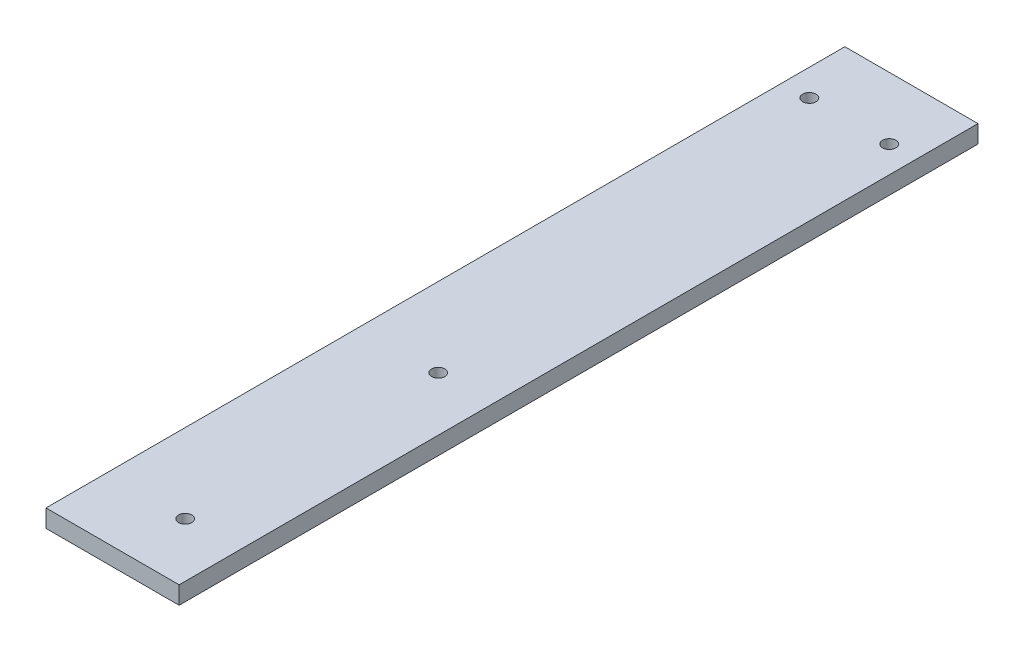
ISO-10303-21;
HEADER;
FILE_DESCRIPTION(('STEP AP214'),'2;1');
FILE_NAME('part.step','',(''),(''),'','','');
FILE_SCHEMA(('AUTOMOTIVE_DESIGN { 1 0 10303 214 1 1 1 1 }'));
ENDSEC;
DATA;
#1=APPLICATION_CONTEXT('core data for automotive mechanical design processes');
#2=APPLICATION_PROTOCOL_DEFINITION('international standard','automotive_design',2000,#1);
#3=PRODUCT_CONTEXT('',#1,'mechanical');
#4=PRODUCT('Part','Part','',(#3));
#5=PRODUCT_RELATED_PRODUCT_CATEGORY('part','',(#4));
#6=PRODUCT_DEFINITION_FORMATION('','',#4);
#7=PRODUCT_DEFINITION_CONTEXT('part definition',#1,'design');
#8=PRODUCT_DEFINITION('design','',#6,#7);
#9=PRODUCT_DEFINITION_SHAPE('','',#8);
#10=(LENGTH_UNIT() NAMED_UNIT(*) SI_UNIT(.MILLI.,.METRE.));
#11=(NAMED_UNIT(*) PLANE_ANGLE_UNIT() SI_UNIT($,.RADIAN.));
#12=(NAMED_UNIT(*) SI_UNIT($,.STERADIAN.) SOLID_ANGLE_UNIT());
#13=UNCERTAINTY_MEASURE_WITH_UNIT(LENGTH_MEASURE(1.E-05),#10,'distance_accuracy_value','');
#14=(GEOMETRIC_REPRESENTATION_CONTEXT(3) GLOBAL_UNCERTAINTY_ASSIGNED_CONTEXT((#13)) GLOBAL_UNIT_ASSIGNED_CONTEXT((#10,
#11,#12)) REPRESENTATION_CONTEXT('',''));
#15=CARTESIAN_POINT('',(0.,0.,0.));
#16=DIRECTION('',(0.,0.,1.));
#17=DIRECTION('',(1.,0.,0.));
#18=AXIS2_PLACEMENT_3D('',#15,#16,#17);
#19=CARTESIAN_POINT('',(15.,0.,90.));
#20=DIRECTION('',(-1.,0.,0.));
#21=DIRECTION('',(0.,0.,1.));
#22=AXIS2_PLACEMENT_3D('',#19,#20,#21);
#23=PLANE('',#22);
#24=DIRECTION('',(0.,1.,0.));
#25=VECTOR('',#24,1.);
#26=CARTESIAN_POINT('',(15.,0.,0.));
#27=LINE('',#26,#25);
#28=CARTESIAN_POINT('',(15.,0.,0.));
#29=VERTEX_POINT('',#28);
#30=CARTESIAN_POINT('',(15.,2.,0.));
#31=VERTEX_POINT('',#30);
#32=EDGE_CURVE('E105',#29,#31,#27,.T.);
#33=ORIENTED_EDGE('',*,*,#32,.T.);
#34=DIRECTION('',(0.,0.,-1.));
#35=VECTOR('',#34,1.);
#36=CARTESIAN_POINT('',(15.,2.,90.));
#37=LINE('',#36,#35);
#38=CARTESIAN_POINT('',(15.,2.,90.));
#39=VERTEX_POINT('',#38);
#40=EDGE_CURVE('E11',#39,#31,#37,.T.);
#41=ORIENTED_EDGE('',*,*,#40,.F.);
#42=DIRECTION('',(0.,1.,0.));
#43=VECTOR('',#42,1.);
#44=CARTESIAN_POINT('',(15.,0.,90.));
#45=LINE('',#44,#43);
#46=CARTESIAN_POINT('',(15.,0.,90.));
#47=VERTEX_POINT('',#46);
#48=EDGE_CURVE('E89',#47,#39,#45,.T.);
#49=ORIENTED_EDGE('',*,*,#48,.F.);
#50=DIRECTION('',(0.,0.,-1.));
#51=VECTOR('',#50,1.);
#52=CARTESIAN_POINT('',(15.,0.,90.));
#53=LINE('',#52,#51);
#54=EDGE_CURVE('E98',#47,#29,#53,.T.);
#55=ORIENTED_EDGE('',*,*,#54,.T.);
#56=EDGE_LOOP('',(#33,#41,#49,#55));
#57=FACE_BOUND('',#56,.T.);
#58=ADVANCED_FACE('F39',(#57),#23,.F.);
#59=CARTESIAN_POINT('',(15.,2.,90.));
#60=DIRECTION('',(0.,-1.,0.));
#61=DIRECTION('',(1.,0.,0.));
#62=AXIS2_PLACEMENT_3D('',#59,#60,#61);
#63=PLANE('',#62);
#64=CARTESIAN_POINT('',(8.90000000000003,2.,83.2200614223714));
#65=DIRECTION('',(0.,1.,0.));
#66=DIRECTION('',(-1.,0.,0.));
#67=AXIS2_PLACEMENT_3D('',#64,#65,#66);
#68=CIRCLE('',#67,0.75);
#69=CARTESIAN_POINT('',(8.15000000000003,2.,83.2200614223714));
#70=VERTEX_POINT('',#69);
#71=EDGE_CURVE('E131',#70,#70,#68,.T.);
#72=ORIENTED_EDGE('',*,*,#71,.F.);
#73=EDGE_LOOP('',(#72));
#74=FACE_BOUND('',#73,.T.);
#75=CARTESIAN_POINT('',(8.89999999999999,2.,54.7200614223714));
#76=DIRECTION('',(0.,1.,0.));
#77=DIRECTION('',(-1.,0.,0.));
#78=AXIS2_PLACEMENT_3D('',#75,#76,#77);
#79=CIRCLE('',#78,0.75);
#80=CARTESIAN_POINT('',(8.14999999999999,2.,54.7200614223714));
#81=VERTEX_POINT('',#80);
#82=EDGE_CURVE('E132',#81,#81,#79,.T.);
#83=ORIENTED_EDGE('',*,*,#82,.F.);
#84=EDGE_LOOP('',(#83));
#85=FACE_BOUND('',#84,.T.);
#86=CARTESIAN_POINT('',(12.,2.,7.));
#87=DIRECTION('',(0.,1.,0.));
#88=DIRECTION('',(-1.,0.,0.));
#89=AXIS2_PLACEMENT_3D('',#86,#87,#88);
#90=CIRCLE('',#89,0.75);
#91=CARTESIAN_POINT('',(11.25,2.,7.));
#92=VERTEX_POINT('',#91);
#93=EDGE_CURVE('E122',#92,#92,#90,.T.);
#94=ORIENTED_EDGE('',*,*,#93,.F.);
#95=EDGE_LOOP('',(#94));
#96=FACE_BOUND('',#95,.T.);
#97=CARTESIAN_POINT('',(3.00000000000003,2.,7.));
#98=DIRECTION('',(0.,1.,0.));
#99=DIRECTION('',(-1.,0.,0.));
#100=AXIS2_PLACEMENT_3D('',#97,#98,#99);
#101=CIRCLE('',#100,0.75);
#102=CARTESIAN_POINT('',(2.25000000000003,2.,7.));
#103=VERTEX_POINT('',#102);
#104=EDGE_CURVE('E116',#103,#103,#101,.T.);
#105=ORIENTED_EDGE('',*,*,#104,.F.);
#106=EDGE_LOOP('',(#105));
#107=FACE_BOUND('',#106,.T.);
#108=DIRECTION('',(-1.,0.,0.));
#109=VECTOR('',#108,1.);
#110=CARTESIAN_POINT('',(15.,2.,0.));
#111=LINE('',#110,#109);
#112=CARTESIAN_POINT('',(0.,2.,0.));
#113=VERTEX_POINT('',#112);
#114=EDGE_CURVE('E94',#31,#113,#111,.T.);
#115=ORIENTED_EDGE('',*,*,#114,.T.);
#116=DIRECTION('',(0.,0.,-1.));
#117=VECTOR('',#116,1.);
#118=CARTESIAN_POINT('',(0.,2.,90.));
#119=LINE('',#118,#117);
#120=CARTESIAN_POINT('',(0.,2.,90.));
#121=VERTEX_POINT('',#120);
#122=EDGE_CURVE('E50',#121,#113,#119,.T.);
#123=ORIENTED_EDGE('',*,*,#122,.F.);
#124=DIRECTION('',(-1.,0.,0.));
#125=VECTOR('',#124,1.);
#126=CARTESIAN_POINT('',(15.,2.,90.));
#127=LINE('',#126,#125);
#128=EDGE_CURVE('E82',#39,#121,#127,.T.);
#129=ORIENTED_EDGE('',*,*,#128,.F.);
#130=ORIENTED_EDGE('',*,*,#40,.T.);
#131=EDGE_LOOP('',(#115,#123,#129,#130));
#132=FACE_BOUND('',#131,.T.);
#133=ADVANCED_FACE('F91',(#74,#85,#96,#107,#132),#63,.F.);
#134=CARTESIAN_POINT('',(0.,0.,90.));
#135=DIRECTION('',(1.,0.,0.));
#136=DIRECTION('',(0.,0.,-1.));
#137=AXIS2_PLACEMENT_3D('',#134,#135,#136);
#138=PLANE('',#137);
#139=DIRECTION('',(0.,-1.,0.));
#140=VECTOR('',#139,1.);
#141=CARTESIAN_POINT('',(0.,0.,0.));
#142=LINE('',#141,#140);
#143=CARTESIAN_POINT('',(0.,0.,0.));
#144=VERTEX_POINT('',#143);
#145=EDGE_CURVE('E75',#113,#144,#142,.T.);
#146=ORIENTED_EDGE('',*,*,#145,.T.);
#147=DIRECTION('',(0.,0.,-1.));
#148=VECTOR('',#147,1.);
#149=CARTESIAN_POINT('',(0.,0.,90.));
#150=LINE('',#149,#148);
#151=CARTESIAN_POINT('',(0.,0.,90.));
#152=VERTEX_POINT('',#151);
#153=EDGE_CURVE('E92',#152,#144,#150,.T.);
#154=ORIENTED_EDGE('',*,*,#153,.F.);
#155=DIRECTION('',(0.,-1.,0.));
#156=VECTOR('',#155,1.);
#157=CARTESIAN_POINT('',(0.,0.,90.));
#158=LINE('',#157,#156);
#159=EDGE_CURVE('E86',#121,#152,#158,.T.);
#160=ORIENTED_EDGE('',*,*,#159,.F.);
#161=ORIENTED_EDGE('',*,*,#122,.T.);
#162=EDGE_LOOP('',(#146,#154,#160,#161));
#163=FACE_BOUND('',#162,.T.);
#164=ADVANCED_FACE('F96',(#163),#138,.F.);
#165=CARTESIAN_POINT('',(15.,0.,90.));
#166=DIRECTION('',(0.,1.,0.));
#167=DIRECTION('',(-1.,0.,0.));
#168=AXIS2_PLACEMENT_3D('',#165,#166,#167);
#169=PLANE('',#168);
#170=CARTESIAN_POINT('',(8.90000000000003,0.,83.2200614223714));
#171=DIRECTION('',(0.,1.,0.));
#172=DIRECTION('',(-1.,0.,0.));
#173=AXIS2_PLACEMENT_3D('',#170,#171,#172);
#174=CIRCLE('',#173,0.75);
#175=CARTESIAN_POINT('',(8.15000000000003,0.,83.2200614223714));
#176=VERTEX_POINT('',#175);
#177=EDGE_CURVE('E104',#176,#176,#174,.T.);
#178=ORIENTED_EDGE('',*,*,#177,.T.);
#179=EDGE_LOOP('',(#178));
#180=FACE_BOUND('',#179,.T.);
#181=CARTESIAN_POINT('',(8.89999999999999,0.,54.7200614223714));
#182=DIRECTION('',(0.,1.,0.));
#183=DIRECTION('',(-1.,0.,0.));
#184=AXIS2_PLACEMENT_3D('',#181,#182,#183);
#185=CIRCLE('',#184,0.75);
#186=CARTESIAN_POINT('',(8.14999999999999,0.,54.7200614223714));
#187=VERTEX_POINT('',#186);
#188=EDGE_CURVE('E126',#187,#187,#185,.T.);
#189=ORIENTED_EDGE('',*,*,#188,.T.);
#190=EDGE_LOOP('',(#189));
#191=FACE_BOUND('',#190,.T.);
#192=CARTESIAN_POINT('',(12.,0.,7.));
#193=DIRECTION('',(0.,1.,0.));
#194=DIRECTION('',(-1.,0.,0.));
#195=AXIS2_PLACEMENT_3D('',#192,#193,#194);
#196=CIRCLE('',#195,0.75);
#197=CARTESIAN_POINT('',(11.25,0.,7.));
#198=VERTEX_POINT('',#197);
#199=EDGE_CURVE('E125',#198,#198,#196,.T.);
#200=ORIENTED_EDGE('',*,*,#199,.T.);
#201=EDGE_LOOP('',(#200));
#202=FACE_BOUND('',#201,.T.);
#203=CARTESIAN_POINT('',(3.00000000000003,0.,7.));
#204=DIRECTION('',(0.,1.,0.));
#205=DIRECTION('',(-1.,0.,0.));
#206=AXIS2_PLACEMENT_3D('',#203,#204,#205);
#207=CIRCLE('',#206,0.75);
#208=CARTESIAN_POINT('',(2.25000000000003,0.,7.));
#209=VERTEX_POINT('',#208);
#210=EDGE_CURVE('E117',#209,#209,#207,.T.);
#211=ORIENTED_EDGE('',*,*,#210,.T.);
#212=EDGE_LOOP('',(#211));
#213=FACE_BOUND('',#212,.T.);
#214=DIRECTION('',(1.,0.,0.));
#215=VECTOR('',#214,1.);
#216=CARTESIAN_POINT('',(15.,0.,0.));
#217=LINE('',#216,#215);
#218=EDGE_CURVE('E79',#144,#29,#217,.T.);
#219=ORIENTED_EDGE('',*,*,#218,.T.);
#220=ORIENTED_EDGE('',*,*,#54,.F.);
#221=DIRECTION('',(1.,0.,0.));
#222=VECTOR('',#221,1.);
#223=CARTESIAN_POINT('',(15.,0.,90.));
#224=LINE('',#223,#222);
#225=EDGE_CURVE('E54',#152,#47,#224,.T.);
#226=ORIENTED_EDGE('',*,*,#225,.F.);
#227=ORIENTED_EDGE('',*,*,#153,.T.);
#228=EDGE_LOOP('',(#219,#220,#226,#227));
#229=FACE_BOUND('',#228,.T.);
#230=ADVANCED_FACE('F109',(#180,#191,#202,#213,#229),#169,.F.);
#231=CARTESIAN_POINT('',(0.,0.,90.));
#232=DIRECTION('',(0.,0.,1.));
#233=DIRECTION('',(1.,0.,0.));
#234=AXIS2_PLACEMENT_3D('',#231,#232,#233);
#235=PLANE('',#234);
#236=ORIENTED_EDGE('',*,*,#48,.T.);
#237=ORIENTED_EDGE('',*,*,#128,.T.);
#238=ORIENTED_EDGE('',*,*,#159,.T.);
#239=ORIENTED_EDGE('',*,*,#225,.T.);
#240=EDGE_LOOP('',(#236,#237,#238,#239));
#241=FACE_BOUND('',#240,.T.);
#242=ADVANCED_FACE('F88',(#241),#235,.T.);
#243=CARTESIAN_POINT('',(0.,0.,0.));
#244=DIRECTION('',(0.,0.,1.));
#245=DIRECTION('',(1.,0.,0.));
#246=AXIS2_PLACEMENT_3D('',#243,#244,#245);
#247=PLANE('',#246);
#248=ORIENTED_EDGE('',*,*,#32,.F.);
#249=ORIENTED_EDGE('',*,*,#218,.F.);
#250=ORIENTED_EDGE('',*,*,#145,.F.);
#251=ORIENTED_EDGE('',*,*,#114,.F.);
#252=EDGE_LOOP('',(#248,#249,#250,#251));
#253=FACE_BOUND('',#252,.T.);
#254=ADVANCED_FACE('F114',(#253),#247,.F.);
#255=CARTESIAN_POINT('',(3.00000000000003,0.,7.));
#256=DIRECTION('',(0.,1.,0.));
#257=DIRECTION('',(-1.,0.,0.));
#258=AXIS2_PLACEMENT_3D('',#255,#256,#257);
#259=CYLINDRICAL_SURFACE('',#258,0.75);
#260=ORIENTED_EDGE('',*,*,#210,.F.);
#261=EDGE_LOOP('',(#260));
#262=FACE_BOUND('',#261,.T.);
#263=ORIENTED_EDGE('',*,*,#104,.T.);
#264=EDGE_LOOP('',(#263));
#265=FACE_BOUND('',#264,.T.);
#266=ADVANCED_FACE('F160',(#262,#265),#259,.F.);
#267=CARTESIAN_POINT('',(12.,0.,7.));
#268=DIRECTION('',(0.,1.,0.));
#269=DIRECTION('',(-1.,0.,0.));
#270=AXIS2_PLACEMENT_3D('',#267,#268,#269);
#271=CYLINDRICAL_SURFACE('',#270,0.75);
#272=ORIENTED_EDGE('',*,*,#199,.F.);
#273=EDGE_LOOP('',(#272));
#274=FACE_BOUND('',#273,.T.);
#275=ORIENTED_EDGE('',*,*,#93,.T.);
#276=EDGE_LOOP('',(#275));
#277=FACE_BOUND('',#276,.T.);
#278=ADVANCED_FACE('F157',(#274,#277),#271,.F.);
#279=CARTESIAN_POINT('',(8.89999999999999,0.,54.7200614223714));
#280=DIRECTION('',(0.,1.,0.));
#281=DIRECTION('',(-1.,0.,0.));
#282=AXIS2_PLACEMENT_3D('',#279,#280,#281);
#283=CYLINDRICAL_SURFACE('',#282,0.75);
#284=ORIENTED_EDGE('',*,*,#188,.F.);
#285=EDGE_LOOP('',(#284));
#286=FACE_BOUND('',#285,.T.);
#287=ORIENTED_EDGE('',*,*,#82,.T.);
#288=EDGE_LOOP('',(#287));
#289=FACE_BOUND('',#288,.T.);
#290=ADVANCED_FACE('F144',(#286,#289),#283,.F.);
#291=CARTESIAN_POINT('',(8.90000000000003,0.,83.2200614223714));
#292=DIRECTION('',(0.,1.,0.));
#293=DIRECTION('',(-1.,0.,0.));
#294=AXIS2_PLACEMENT_3D('',#291,#292,#293);
#295=CYLINDRICAL_SURFACE('',#294,0.75);
#296=ORIENTED_EDGE('',*,*,#177,.F.);
#297=EDGE_LOOP('',(#296));
#298=FACE_BOUND('',#297,.T.);
#299=ORIENTED_EDGE('',*,*,#71,.T.);
#300=EDGE_LOOP('',(#299));
#301=FACE_BOUND('',#300,.T.);
#302=ADVANCED_FACE('F142',(#298,#301),#295,.F.);
#303=CLOSED_SHELL('',(#58,#133,#164,#230,#242,#254,#266,#278,#290,#302));
#304=MANIFOLD_SOLID_BREP('B2',#303);
#305=ADVANCED_BREP_SHAPE_REPRESENTATION('',(#18,#304),#14);
#306=SHAPE_DEFINITION_REPRESENTATION(#9,#305);
ENDSEC;
END-ISO-10303-21;
